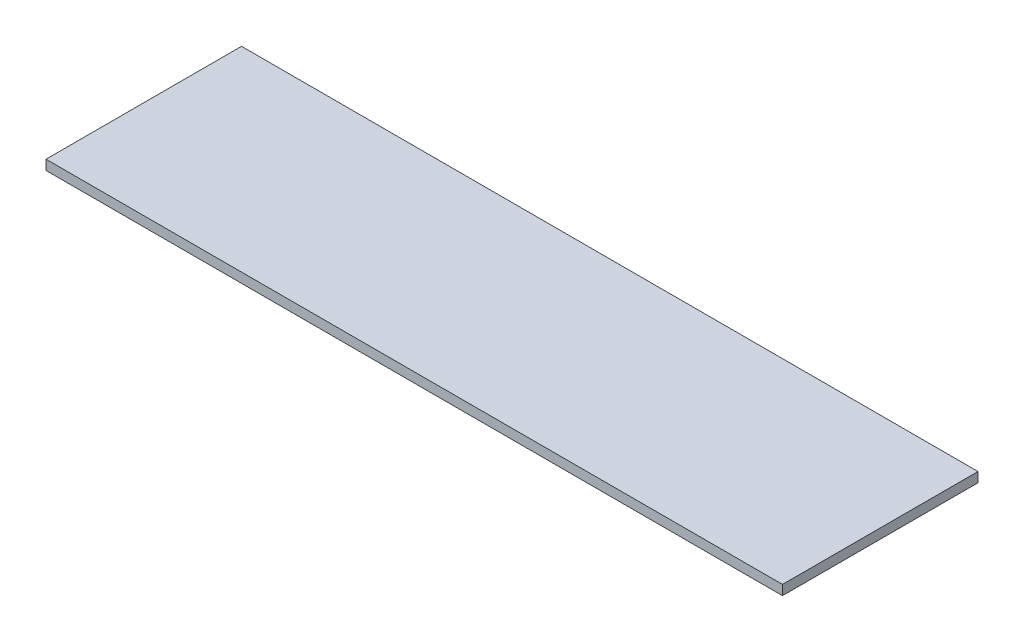
ISO-10303-21;
HEADER;
FILE_DESCRIPTION(('STEP AP214'),'2;1');
FILE_NAME('part.step','',(''),(''),'','','');
FILE_SCHEMA(('AUTOMOTIVE_DESIGN { 1 0 10303 214 1 1 1 1 }'));
ENDSEC;
DATA;
#1=APPLICATION_CONTEXT('core data for automotive mechanical design processes');
#2=APPLICATION_PROTOCOL_DEFINITION('international standard','automotive_design',2000,#1);
#3=PRODUCT_CONTEXT('',#1,'mechanical');
#4=PRODUCT('Part','Part','',(#3));
#5=PRODUCT_RELATED_PRODUCT_CATEGORY('part','',(#4));
#6=PRODUCT_DEFINITION_FORMATION('','',#4);
#7=PRODUCT_DEFINITION_CONTEXT('part definition',#1,'design');
#8=PRODUCT_DEFINITION('design','',#6,#7);
#9=PRODUCT_DEFINITION_SHAPE('','',#8);
#10=(LENGTH_UNIT() NAMED_UNIT(*) SI_UNIT(.MILLI.,.METRE.));
#11=(NAMED_UNIT(*) PLANE_ANGLE_UNIT() SI_UNIT($,.RADIAN.));
#12=(NAMED_UNIT(*) SI_UNIT($,.STERADIAN.) SOLID_ANGLE_UNIT());
#13=UNCERTAINTY_MEASURE_WITH_UNIT(LENGTH_MEASURE(1.E-05),#10,'distance_accuracy_value','');
#14=(GEOMETRIC_REPRESENTATION_CONTEXT(3) GLOBAL_UNCERTAINTY_ASSIGNED_CONTEXT((#13)) GLOBAL_UNIT_ASSIGNED_CONTEXT((#10,
#11,#12)) REPRESENTATION_CONTEXT('',''));
#15=CARTESIAN_POINT('',(0.,0.,0.));
#16=DIRECTION('',(0.,0.,1.));
#17=DIRECTION('',(1.,0.,0.));
#18=AXIS2_PLACEMENT_3D('',#15,#16,#17);
#19=CARTESIAN_POINT('',(0.,3.,0.));
#20=DIRECTION('',(1.,0.,0.));
#21=DIRECTION('',(0.,0.,-1.));
#22=AXIS2_PLACEMENT_3D('',#19,#20,#21);
#23=PLANE('',#22);
#24=DIRECTION('',(0.,0.,1.));
#25=VECTOR('',#24,1.);
#26=CARTESIAN_POINT('',(0.,0.,0.));
#27=LINE('',#26,#25);
#28=CARTESIAN_POINT('',(0.,0.,0.));
#29=VERTEX_POINT('',#28);
#30=CARTESIAN_POINT('',(0.,0.,60.));
#31=VERTEX_POINT('',#30);
#32=EDGE_CURVE('E98',#29,#31,#27,.T.);
#33=ORIENTED_EDGE('',*,*,#32,.T.);
#34=DIRECTION('',(0.,-1.,0.));
#35=VECTOR('',#34,1.);
#36=CARTESIAN_POINT('',(0.,3.,60.));
#37=LINE('',#36,#35);
#38=CARTESIAN_POINT('',(0.,3.,60.));
#39=VERTEX_POINT('',#38);
#40=EDGE_CURVE('E11',#39,#31,#37,.T.);
#41=ORIENTED_EDGE('',*,*,#40,.F.);
#42=DIRECTION('',(0.,0.,1.));
#43=VECTOR('',#42,1.);
#44=CARTESIAN_POINT('',(0.,3.,0.));
#45=LINE('',#44,#43);
#46=CARTESIAN_POINT('',(0.,3.,0.));
#47=VERTEX_POINT('',#46);
#48=EDGE_CURVE('E86',#47,#39,#45,.T.);
#49=ORIENTED_EDGE('',*,*,#48,.F.);
#50=DIRECTION('',(0.,-1.,0.));
#51=VECTOR('',#50,1.);
#52=CARTESIAN_POINT('',(0.,3.,0.));
#53=LINE('',#52,#51);
#54=EDGE_CURVE('E94',#47,#29,#53,.T.);
#55=ORIENTED_EDGE('',*,*,#54,.T.);
#56=EDGE_LOOP('',(#33,#41,#49,#55));
#57=FACE_BOUND('',#56,.T.);
#58=ADVANCED_FACE('F35',(#57),#23,.F.);
#59=CARTESIAN_POINT('',(0.,3.,60.));
#60=DIRECTION('',(0.,0.,-1.));
#61=DIRECTION('',(-1.,0.,0.));
#62=AXIS2_PLACEMENT_3D('',#59,#60,#61);
#63=PLANE('',#62);
#64=DIRECTION('',(1.,0.,0.));
#65=VECTOR('',#64,1.);
#66=CARTESIAN_POINT('',(0.,0.,60.));
#67=LINE('',#66,#65);
#68=CARTESIAN_POINT('',(226.,0.,60.));
#69=VERTEX_POINT('',#68);
#70=EDGE_CURVE('E90',#31,#69,#67,.T.);
#71=ORIENTED_EDGE('',*,*,#70,.T.);
#72=DIRECTION('',(0.,-1.,0.));
#73=VECTOR('',#72,1.);
#74=CARTESIAN_POINT('',(226.,3.,60.));
#75=LINE('',#74,#73);
#76=CARTESIAN_POINT('',(226.,3.,60.));
#77=VERTEX_POINT('',#76);
#78=EDGE_CURVE('E43',#77,#69,#75,.T.);
#79=ORIENTED_EDGE('',*,*,#78,.F.);
#80=DIRECTION('',(1.,0.,0.));
#81=VECTOR('',#80,1.);
#82=CARTESIAN_POINT('',(0.,3.,60.));
#83=LINE('',#82,#81);
#84=EDGE_CURVE('E81',#39,#77,#83,.T.);
#85=ORIENTED_EDGE('',*,*,#84,.F.);
#86=ORIENTED_EDGE('',*,*,#40,.T.);
#87=EDGE_LOOP('',(#71,#79,#85,#86));
#88=FACE_BOUND('',#87,.T.);
#89=ADVANCED_FACE('F89',(#88),#63,.F.);
#90=CARTESIAN_POINT('',(226.,3.,0.));
#91=DIRECTION('',(-1.,0.,0.));
#92=DIRECTION('',(0.,0.,1.));
#93=AXIS2_PLACEMENT_3D('',#90,#91,#92);
#94=PLANE('',#93);
#95=DIRECTION('',(0.,0.,-1.));
#96=VECTOR('',#95,1.);
#97=CARTESIAN_POINT('',(226.,0.,0.));
#98=LINE('',#97,#96);
#99=CARTESIAN_POINT('',(226.,0.,0.));
#100=VERTEX_POINT('',#99);
#101=EDGE_CURVE('E68',#69,#100,#98,.T.);
#102=ORIENTED_EDGE('',*,*,#101,.T.);
#103=DIRECTION('',(0.,-1.,0.));
#104=VECTOR('',#103,1.);
#105=CARTESIAN_POINT('',(226.,3.,0.));
#106=LINE('',#105,#104);
#107=CARTESIAN_POINT('',(226.,3.,0.));
#108=VERTEX_POINT('',#107);
#109=EDGE_CURVE('E91',#108,#100,#106,.T.);
#110=ORIENTED_EDGE('',*,*,#109,.F.);
#111=DIRECTION('',(0.,0.,-1.));
#112=VECTOR('',#111,1.);
#113=CARTESIAN_POINT('',(226.,3.,0.));
#114=LINE('',#113,#112);
#115=EDGE_CURVE('E84',#77,#108,#114,.T.);
#116=ORIENTED_EDGE('',*,*,#115,.F.);
#117=ORIENTED_EDGE('',*,*,#78,.T.);
#118=EDGE_LOOP('',(#102,#110,#116,#117));
#119=FACE_BOUND('',#118,.T.);
#120=ADVANCED_FACE('F92',(#119),#94,.F.);
#121=CARTESIAN_POINT('',(0.,3.,0.));
#122=DIRECTION('',(0.,0.,1.));
#123=DIRECTION('',(1.,0.,0.));
#124=AXIS2_PLACEMENT_3D('',#121,#122,#123);
#125=PLANE('',#124);
#126=DIRECTION('',(-1.,0.,0.));
#127=VECTOR('',#126,1.);
#128=CARTESIAN_POINT('',(0.,0.,0.));
#129=LINE('',#128,#127);
#130=EDGE_CURVE('E74',#100,#29,#129,.T.);
#131=ORIENTED_EDGE('',*,*,#130,.T.);
#132=ORIENTED_EDGE('',*,*,#54,.F.);
#133=DIRECTION('',(-1.,0.,0.));
#134=VECTOR('',#133,1.);
#135=CARTESIAN_POINT('',(0.,3.,0.));
#136=LINE('',#135,#134);
#137=EDGE_CURVE('E51',#108,#47,#136,.T.);
#138=ORIENTED_EDGE('',*,*,#137,.F.);
#139=ORIENTED_EDGE('',*,*,#109,.T.);
#140=EDGE_LOOP('',(#131,#132,#138,#139));
#141=FACE_BOUND('',#140,.T.);
#142=ADVANCED_FACE('F105',(#141),#125,.F.);
#143=CARTESIAN_POINT('',(0.,3.,0.));
#144=DIRECTION('',(0.,1.,0.));
#145=DIRECTION('',(0.,0.,1.));
#146=AXIS2_PLACEMENT_3D('',#143,#144,#145);
#147=PLANE('',#146);
#148=ORIENTED_EDGE('',*,*,#48,.T.);
#149=ORIENTED_EDGE('',*,*,#84,.T.);
#150=ORIENTED_EDGE('',*,*,#115,.T.);
#151=ORIENTED_EDGE('',*,*,#137,.T.);
#152=EDGE_LOOP('',(#148,#149,#150,#151));
#153=FACE_BOUND('',#152,.T.);
#154=ADVANCED_FACE('F82',(#153),#147,.T.);
#155=CARTESIAN_POINT('',(0.,0.,0.));
#156=DIRECTION('',(0.,1.,0.));
#157=DIRECTION('',(0.,0.,1.));
#158=AXIS2_PLACEMENT_3D('',#155,#156,#157);
#159=PLANE('',#158);
#160=ORIENTED_EDGE('',*,*,#32,.F.);
#161=ORIENTED_EDGE('',*,*,#130,.F.);
#162=ORIENTED_EDGE('',*,*,#101,.F.);
#163=ORIENTED_EDGE('',*,*,#70,.F.);
#164=EDGE_LOOP('',(#160,#161,#162,#163));
#165=FACE_BOUND('',#164,.T.);
#166=ADVANCED_FACE('F108',(#165),#159,.F.);
#167=CLOSED_SHELL('',(#58,#89,#120,#142,#154,#166));
#168=MANIFOLD_SOLID_BREP('B2',#167);
#169=ADVANCED_BREP_SHAPE_REPRESENTATION('',(#18,#168),#14);
#170=SHAPE_DEFINITION_REPRESENTATION(#9,#169);
ENDSEC;
END-ISO-10303-21;
